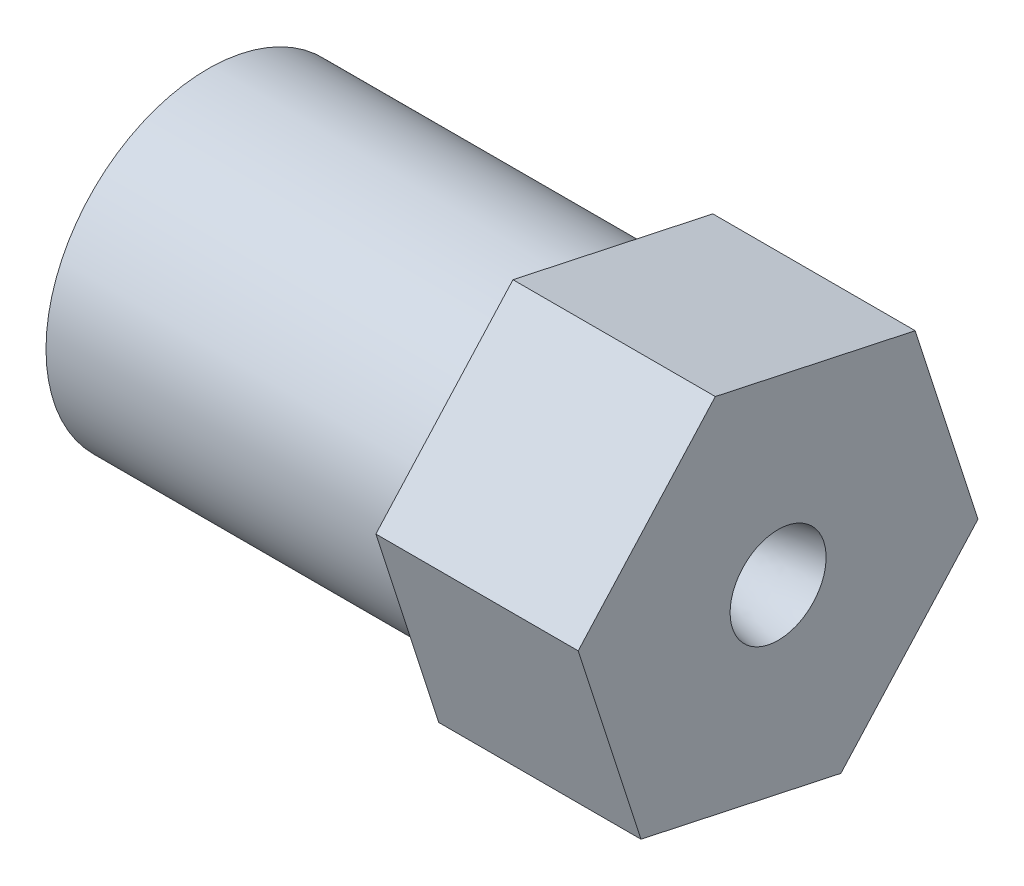
ISO-10303-21;
HEADER;
FILE_DESCRIPTION(('STEP AP214'),'2;1');
FILE_NAME('part.step','',(''),(''),'','','');
FILE_SCHEMA(('AUTOMOTIVE_DESIGN { 1 0 10303 214 1 1 1 1 }'));
ENDSEC;
DATA;
#1=APPLICATION_CONTEXT('core data for automotive mechanical design processes');
#2=APPLICATION_PROTOCOL_DEFINITION('international standard','automotive_design',2000,#1);
#3=PRODUCT_CONTEXT('',#1,'mechanical');
#4=PRODUCT('Part','Part','',(#3));
#5=PRODUCT_RELATED_PRODUCT_CATEGORY('part','',(#4));
#6=PRODUCT_DEFINITION_FORMATION('','',#4);
#7=PRODUCT_DEFINITION_CONTEXT('part definition',#1,'design');
#8=PRODUCT_DEFINITION('design','',#6,#7);
#9=PRODUCT_DEFINITION_SHAPE('','',#8);
#10=(LENGTH_UNIT() NAMED_UNIT(*) SI_UNIT(.MILLI.,.METRE.));
#11=(NAMED_UNIT(*) PLANE_ANGLE_UNIT() SI_UNIT($,.RADIAN.));
#12=(NAMED_UNIT(*) SI_UNIT($,.STERADIAN.) SOLID_ANGLE_UNIT());
#13=UNCERTAINTY_MEASURE_WITH_UNIT(LENGTH_MEASURE(1.E-05),#10,'distance_accuracy_value','');
#14=(GEOMETRIC_REPRESENTATION_CONTEXT(3) GLOBAL_UNCERTAINTY_ASSIGNED_CONTEXT((#13)) GLOBAL_UNIT_ASSIGNED_CONTEXT((#10,
#11,#12)) REPRESENTATION_CONTEXT('',''));
#15=CARTESIAN_POINT('',(0.,0.,0.));
#16=DIRECTION('',(0.,0.,1.));
#17=DIRECTION('',(1.,0.,0.));
#18=AXIS2_PLACEMENT_3D('',#15,#16,#17);
#19=CARTESIAN_POINT('',(0.,0.,0.));
#20=DIRECTION('',(-1.,0.,0.));
#21=DIRECTION('',(0.,0.,1.));
#22=AXIS2_PLACEMENT_3D('',#19,#20,#21);
#23=CYLINDRICAL_SURFACE('',#22,10.16);
#24=CARTESIAN_POINT('',(-9.29665282254042,0.,0.));
#25=DIRECTION('',(1.,0.,0.));
#26=DIRECTION('',(0.,0.,-1.));
#27=AXIS2_PLACEMENT_3D('',#24,#25,#26);
#28=CIRCLE('',#27,10.16);
#29=CARTESIAN_POINT('',(-9.29665282254042,0.,-10.16));
#30=VERTEX_POINT('',#29);
#31=EDGE_CURVE('E11',#30,#30,#28,.F.);
#32=ORIENTED_EDGE('',*,*,#31,.T.);
#33=EDGE_LOOP('',(#32));
#34=FACE_BOUND('',#33,.T.);
#35=CARTESIAN_POINT('',(-31.75,0.,0.));
#36=DIRECTION('',(-1.,0.,0.));
#37=DIRECTION('',(0.,0.,1.));
#38=AXIS2_PLACEMENT_3D('',#35,#36,#37);
#39=CIRCLE('',#38,10.16);
#40=CARTESIAN_POINT('',(-31.75,0.,10.16));
#41=VERTEX_POINT('',#40);
#42=EDGE_CURVE('E225',#41,#41,#39,.T.);
#43=ORIENTED_EDGE('',*,*,#42,.F.);
#44=EDGE_LOOP('',(#43));
#45=FACE_BOUND('',#44,.T.);
#46=ADVANCED_FACE('F37',(#34,#45),#23,.T.);
#47=CARTESIAN_POINT('',(0.,0.,0.));
#48=DIRECTION('',(-1.,0.,0.));
#49=DIRECTION('',(0.,0.,1.));
#50=AXIS2_PLACEMENT_3D('',#47,#48,#49);
#51=TOROIDAL_SURFACE('',#50,5.08,3.048);
#52=CARTESIAN_POINT('',(0.,0.,0.));
#53=DIRECTION('',(-1.,0.,0.));
#54=DIRECTION('',(0.,0.,1.));
#55=AXIS2_PLACEMENT_3D('',#52,#53,#54);
#56=CIRCLE('',#55,2.0319999999418);
#57=CARTESIAN_POINT('',(0.,0.,2.0319999999418));
#58=VERTEX_POINT('',#57);
#59=EDGE_CURVE('E177',#58,#58,#56,.T.);
#60=ORIENTED_EDGE('',*,*,#59,.F.);
#61=EDGE_LOOP('',(#60));
#62=FACE_BOUND('',#61,.T.);
#63=CARTESIAN_POINT('',(-2.15526146905657,0.,0.));
#64=DIRECTION('',(-1.,0.,0.));
#65=DIRECTION('',(0.,0.,1.));
#66=AXIS2_PLACEMENT_3D('',#63,#64,#65);
#67=CIRCLE('',#66,2.92473853094338);
#68=CARTESIAN_POINT('',(-2.15526146905657,0.,2.92473853094338));
#69=VERTEX_POINT('',#68);
#70=EDGE_CURVE('E142',#69,#69,#67,.T.);
#71=ORIENTED_EDGE('',*,*,#70,.T.);
#72=EDGE_LOOP('',(#71));
#73=FACE_BOUND('',#72,.T.);
#74=ADVANCED_FACE('F166',(#62,#73),#51,.T.);
#75=CARTESIAN_POINT('',(0.,0.,0.));
#76=DIRECTION('',(-1.,0.,0.));
#77=DIRECTION('',(0.,0.,1.));
#78=AXIS2_PLACEMENT_3D('',#75,#76,#77);
#79=TOROIDAL_SURFACE('',#78,2.8448,0.812800000058198);
#80=CARTESIAN_POINT('',(0.277993973659463,0.,0.));
#81=DIRECTION('',(-1.,0.,0.));
#82=DIRECTION('',(0.,0.,1.));
#83=AXIS2_PLACEMENT_3D('',#80,#81,#82);
#84=CIRCLE('',#83,2.08101783825132);
#85=CARTESIAN_POINT('',(0.277993973659463,0.,2.08101783825132));
#86=VERTEX_POINT('',#85);
#87=EDGE_CURVE('E231',#86,#86,#84,.T.);
#88=ORIENTED_EDGE('',*,*,#87,.F.);
#89=EDGE_LOOP('',(#88));
#90=FACE_BOUND('',#89,.T.);
#91=ORIENTED_EDGE('',*,*,#59,.T.);
#92=EDGE_LOOP('',(#91));
#93=FACE_BOUND('',#92,.T.);
#94=ADVANCED_FACE('F162',(#90,#93),#79,.T.);
#95=CARTESIAN_POINT('',(336362.672829223,-941749.791811561,0.));
#96=CARTESIAN_POINT('',(-342019.865333832,939694.701802969,0.));
#97=CARTESIAN_POINT('',(347678.16981433,-937631.287723025,0.));
#98=B_SPLINE_CURVE_WITH_KNOTS('',2,(#95,#96,#97),.UNSPECIFIED.,.F.,.F.,(3,3),(0.,1.),.UNSPECIFIED.);
#99=CARTESIAN_POINT('',(0.,0.,0.));
#100=DIRECTION('',(-1.,0.,0.));
#101=AXIS1_PLACEMENT('',#99,#100);
#102=SURFACE_OF_REVOLUTION('',#98,#101);
#103=CARTESIAN_POINT('',(4.03834717745957,0.,0.));
#104=DIRECTION('',(-1.,0.,0.));
#105=DIRECTION('',(0.,0.,1.));
#106=AXIS2_PLACEMENT_3D('',#103,#104,#105);
#107=CIRCLE('',#106,3.01394306515568);
#108=CARTESIAN_POINT('',(4.03834717745957,0.,3.01394306515568));
#109=VERTEX_POINT('',#108);
#110=EDGE_CURVE('E228',#109,#109,#107,.T.);
#111=ORIENTED_EDGE('',*,*,#110,.F.);
#112=EDGE_LOOP('',(#111));
#113=FACE_BOUND('',#112,.T.);
#114=ORIENTED_EDGE('',*,*,#87,.T.);
#115=EDGE_LOOP('',(#114));
#116=FACE_BOUND('',#115,.T.);
#117=ADVANCED_FACE('F157',(#113,#116),#102,.T.);
#118=CARTESIAN_POINT('',(4.03834717745957,10.16,0.));
#119=DIRECTION('',(-1.,0.,0.));
#120=DIRECTION('',(0.,0.,1.));
#121=AXIS2_PLACEMENT_3D('',#118,#119,#120);
#122=PLANE('',#121);
#123=ORIENTED_EDGE('',*,*,#110,.T.);
#124=EDGE_LOOP('',(#123));
#125=FACE_BOUND('',#124,.T.);
#126=DIRECTION('',(0.,-0.951681663898051,-0.307086324345838));
#127=VECTOR('',#126,1.);
#128=CARTESIAN_POINT('',(4.03834717745957,-3.41249677929312,10.5755624900671));
#129=LINE('',#128,#127);
#130=CARTESIAN_POINT('',(4.03834717745957,2.69330707117882,12.5457684242007));
#131=VERTEX_POINT('',#130);
#132=CARTESIAN_POINT('',(4.03834717745957,-9.51830062976507,8.60535655593348));
#133=VERTEX_POINT('',#132);
#134=EDGE_CURVE('E125',#131,#133,#129,.T.);
#135=ORIENTED_EDGE('',*,*,#134,.T.);
#136=DIRECTION('',(0.,-0.209896273910742,-0.977723659424475));
#137=VECTOR('',#136,1.);
#138=CARTESIAN_POINT('',(4.03834717745957,-10.8649541653545,2.33247234383312));
#139=LINE('',#138,#137);
#140=CARTESIAN_POINT('',(4.03834717745957,-12.2116077009439,-3.94041186826723));
#141=VERTEX_POINT('',#140);
#142=EDGE_CURVE('E128',#133,#141,#139,.T.);
#143=ORIENTED_EDGE('',*,*,#142,.T.);
#144=DIRECTION('',(0.,0.741785389987309,-0.670637335078637));
#145=VECTOR('',#144,1.);
#146=CARTESIAN_POINT('',(4.03834717745957,-7.45245738606136,-8.24309014623397));
#147=LINE('',#146,#145);
#148=CARTESIAN_POINT('',(4.03834717745957,-2.69330707117882,-12.5457684242007));
#149=VERTEX_POINT('',#148);
#150=EDGE_CURVE('E131',#141,#149,#147,.T.);
#151=ORIENTED_EDGE('',*,*,#150,.T.);
#152=DIRECTION('',(0.,0.951681663898051,0.307086324345838));
#153=VECTOR('',#152,1.);
#154=CARTESIAN_POINT('',(4.03834717745957,3.41249677929312,-10.5755624900671));
#155=LINE('',#154,#153);
#156=CARTESIAN_POINT('',(4.03834717745957,9.51830062976506,-8.60535655593348));
#157=VERTEX_POINT('',#156);
#158=EDGE_CURVE('E134',#149,#157,#155,.T.);
#159=ORIENTED_EDGE('',*,*,#158,.T.);
#160=DIRECTION('',(0.,0.209896273910742,0.977723659424475));
#161=VECTOR('',#160,1.);
#162=CARTESIAN_POINT('',(4.03834717745957,10.8649541653545,-2.33247234383312));
#163=LINE('',#162,#161);
#164=CARTESIAN_POINT('',(4.03834717745957,12.2116077009439,3.94041186826724));
#165=VERTEX_POINT('',#164);
#166=EDGE_CURVE('E102',#157,#165,#163,.T.);
#167=ORIENTED_EDGE('',*,*,#166,.T.);
#168=DIRECTION('',(0.,-0.741785389987309,0.670637335078637));
#169=VECTOR('',#168,1.);
#170=CARTESIAN_POINT('',(4.03834717745957,7.45245738606136,8.24309014623397));
#171=LINE('',#170,#169);
#172=EDGE_CURVE('E137',#165,#131,#171,.T.);
#173=ORIENTED_EDGE('',*,*,#172,.T.);
#174=EDGE_LOOP('',(#135,#143,#151,#159,#167,#173));
#175=FACE_BOUND('',#174,.T.);
#176=ADVANCED_FACE('F161',(#125,#175),#122,.F.);
#177=CARTESIAN_POINT('',(-31.75,10.16,0.));
#178=DIRECTION('',(1.,0.,0.));
#179=DIRECTION('',(0.,0.,-1.));
#180=AXIS2_PLACEMENT_3D('',#177,#178,#179);
#181=PLANE('',#180);
#182=CARTESIAN_POINT('',(-31.75,0.,0.));
#183=DIRECTION('',(-1.,0.,0.));
#184=DIRECTION('',(0.,0.,1.));
#185=AXIS2_PLACEMENT_3D('',#182,#183,#184);
#186=CIRCLE('',#185,8.6614);
#187=CARTESIAN_POINT('',(-31.75,0.,8.6614));
#188=VERTEX_POINT('',#187);
#189=EDGE_CURVE('E222',#188,#188,#186,.T.);
#190=ORIENTED_EDGE('',*,*,#189,.F.);
#191=EDGE_LOOP('',(#190));
#192=FACE_BOUND('',#191,.T.);
#193=ORIENTED_EDGE('',*,*,#42,.T.);
#194=EDGE_LOOP('',(#193));
#195=FACE_BOUND('',#194,.T.);
#196=ADVANCED_FACE('F249',(#192,#195),#181,.F.);
#197=CARTESIAN_POINT('',(-31.115,0.,0.));
#198=DIRECTION('',(-1.,0.,0.));
#199=DIRECTION('',(0.,0.,1.));
#200=AXIS2_PLACEMENT_3D('',#197,#198,#199);
#201=TOROIDAL_SURFACE('',#200,8.6614,0.635);
#202=CARTESIAN_POINT('',(-31.115,0.,0.));
#203=DIRECTION('',(-1.,0.,0.));
#204=DIRECTION('',(0.,0.,1.));
#205=AXIS2_PLACEMENT_3D('',#202,#203,#204);
#206=CIRCLE('',#205,8.02639999999999);
#207=CARTESIAN_POINT('',(-31.115,0.,8.02639999999999));
#208=VERTEX_POINT('',#207);
#209=EDGE_CURVE('E219',#208,#208,#206,.T.);
#210=ORIENTED_EDGE('',*,*,#209,.F.);
#211=EDGE_LOOP('',(#210));
#212=FACE_BOUND('',#211,.T.);
#213=ORIENTED_EDGE('',*,*,#189,.T.);
#214=EDGE_LOOP('',(#213));
#215=FACE_BOUND('',#214,.T.);
#216=ADVANCED_FACE('F251',(#212,#215),#201,.T.);
#217=CARTESIAN_POINT('',(0.,0.,0.));
#218=DIRECTION('',(-1.,0.,0.));
#219=DIRECTION('',(0.,0.,1.));
#220=AXIS2_PLACEMENT_3D('',#217,#218,#219);
#221=CYLINDRICAL_SURFACE('',#220,8.02639999999999);
#222=CARTESIAN_POINT('',(-25.019,0.,0.));
#223=DIRECTION('',(-1.,0.,0.));
#224=DIRECTION('',(0.,0.,1.));
#225=AXIS2_PLACEMENT_3D('',#222,#223,#224);
#226=CIRCLE('',#225,8.02639999999999);
#227=CARTESIAN_POINT('',(-25.019,0.,8.02639999999999));
#228=VERTEX_POINT('',#227);
#229=EDGE_CURVE('E216',#228,#228,#226,.T.);
#230=ORIENTED_EDGE('',*,*,#229,.F.);
#231=EDGE_LOOP('',(#230));
#232=FACE_BOUND('',#231,.T.);
#233=ORIENTED_EDGE('',*,*,#209,.T.);
#234=EDGE_LOOP('',(#233));
#235=FACE_BOUND('',#234,.T.);
#236=ADVANCED_FACE('F258',(#232,#235),#221,.F.);
#237=CARTESIAN_POINT('',(-25.019,0.,0.));
#238=DIRECTION('',(-1.,0.,0.));
#239=DIRECTION('',(0.,0.,1.));
#240=AXIS2_PLACEMENT_3D('',#237,#238,#239);
#241=TOROIDAL_SURFACE('',#240,7.89939999999999,0.127);
#242=CARTESIAN_POINT('',(-24.892,0.,0.));
#243=DIRECTION('',(-1.,0.,0.));
#244=DIRECTION('',(0.,0.,1.));
#245=AXIS2_PLACEMENT_3D('',#242,#243,#244);
#246=CIRCLE('',#245,7.89939999999999);
#247=CARTESIAN_POINT('',(-24.892,0.,7.89939999999999));
#248=VERTEX_POINT('',#247);
#249=EDGE_CURVE('E213',#248,#248,#246,.T.);
#250=ORIENTED_EDGE('',*,*,#249,.F.);
#251=EDGE_LOOP('',(#250));
#252=FACE_BOUND('',#251,.T.);
#253=ORIENTED_EDGE('',*,*,#229,.T.);
#254=EDGE_LOOP('',(#253));
#255=FACE_BOUND('',#254,.T.);
#256=ADVANCED_FACE('F266',(#252,#255),#241,.F.);
#257=CARTESIAN_POINT('',(-24.892,6.9469,0.));
#258=DIRECTION('',(1.,0.,0.));
#259=DIRECTION('',(0.,0.,-1.));
#260=AXIS2_PLACEMENT_3D('',#257,#258,#259);
#261=PLANE('',#260);
#262=CARTESIAN_POINT('',(-24.892,0.,0.));
#263=DIRECTION('',(-1.,0.,0.));
#264=DIRECTION('',(0.,0.,1.));
#265=AXIS2_PLACEMENT_3D('',#262,#263,#264);
#266=CIRCLE('',#265,6.9469);
#267=CARTESIAN_POINT('',(-24.892,0.,6.9469));
#268=VERTEX_POINT('',#267);
#269=EDGE_CURVE('E210',#268,#268,#266,.T.);
#270=ORIENTED_EDGE('',*,*,#269,.F.);
#271=EDGE_LOOP('',(#270));
#272=FACE_BOUND('',#271,.T.);
#273=ORIENTED_EDGE('',*,*,#249,.T.);
#274=EDGE_LOOP('',(#273));
#275=FACE_BOUND('',#274,.T.);
#276=ADVANCED_FACE('F270',(#272,#275),#261,.F.);
#277=CARTESIAN_POINT('',(0.,0.,0.));
#278=DIRECTION('',(-1.,0.,0.));
#279=DIRECTION('',(0.,0.,1.));
#280=AXIS2_PLACEMENT_3D('',#277,#278,#279);
#281=CYLINDRICAL_SURFACE('',#280,6.9469);
#282=CARTESIAN_POINT('',(-20.066,0.,0.));
#283=DIRECTION('',(-1.,0.,0.));
#284=DIRECTION('',(0.,0.,1.));
#285=AXIS2_PLACEMENT_3D('',#282,#283,#284);
#286=CIRCLE('',#285,6.9469);
#287=CARTESIAN_POINT('',(-20.066,0.,6.9469));
#288=VERTEX_POINT('',#287);
#289=EDGE_CURVE('E207',#288,#288,#286,.T.);
#290=ORIENTED_EDGE('',*,*,#289,.F.);
#291=EDGE_LOOP('',(#290));
#292=FACE_BOUND('',#291,.T.);
#293=ORIENTED_EDGE('',*,*,#269,.T.);
#294=EDGE_LOOP('',(#293));
#295=FACE_BOUND('',#294,.T.);
#296=ADVANCED_FACE('F274',(#292,#295),#281,.F.);
#297=CARTESIAN_POINT('',(-20.066,0.,0.));
#298=DIRECTION('',(-1.,0.,0.));
#299=DIRECTION('',(0.,0.,1.));
#300=AXIS2_PLACEMENT_3D('',#297,#298,#299);
#301=TOROIDAL_SURFACE('',#300,6.8199,0.127);
#302=CARTESIAN_POINT('',(-19.939,0.,0.));
#303=DIRECTION('',(-1.,0.,0.));
#304=DIRECTION('',(0.,0.,1.));
#305=AXIS2_PLACEMENT_3D('',#302,#303,#304);
#306=CIRCLE('',#305,6.8199);
#307=CARTESIAN_POINT('',(-19.939,0.,6.8199));
#308=VERTEX_POINT('',#307);
#309=EDGE_CURVE('E204',#308,#308,#306,.T.);
#310=ORIENTED_EDGE('',*,*,#309,.F.);
#311=EDGE_LOOP('',(#310));
#312=FACE_BOUND('',#311,.T.);
#313=ORIENTED_EDGE('',*,*,#289,.T.);
#314=EDGE_LOOP('',(#313));
#315=FACE_BOUND('',#314,.T.);
#316=ADVANCED_FACE('F278',(#312,#315),#301,.F.);
#317=CARTESIAN_POINT('',(-19.939,5.46100000000001,0.));
#318=DIRECTION('',(1.,0.,0.));
#319=DIRECTION('',(0.,0.,-1.));
#320=AXIS2_PLACEMENT_3D('',#317,#318,#319);
#321=PLANE('',#320);
#322=CARTESIAN_POINT('',(-19.939,0.,0.));
#323=DIRECTION('',(-1.,0.,0.));
#324=DIRECTION('',(0.,0.,1.));
#325=AXIS2_PLACEMENT_3D('',#322,#323,#324);
#326=CIRCLE('',#325,5.46100000000001);
#327=CARTESIAN_POINT('',(-19.939,0.,5.46100000000001));
#328=VERTEX_POINT('',#327);
#329=EDGE_CURVE('E201',#328,#328,#326,.T.);
#330=ORIENTED_EDGE('',*,*,#329,.F.);
#331=EDGE_LOOP('',(#330));
#332=FACE_BOUND('',#331,.T.);
#333=ORIENTED_EDGE('',*,*,#309,.T.);
#334=EDGE_LOOP('',(#333));
#335=FACE_BOUND('',#334,.T.);
#336=ADVANCED_FACE('F282',(#332,#335),#321,.F.);
#337=CARTESIAN_POINT('',(-19.304,0.,0.));
#338=DIRECTION('',(-1.,0.,0.));
#339=DIRECTION('',(0.,0.,1.));
#340=AXIS2_PLACEMENT_3D('',#337,#338,#339);
#341=TOROIDAL_SURFACE('',#340,5.461,0.635);
#342=CARTESIAN_POINT('',(-19.304,0.,0.));
#343=DIRECTION('',(-1.,0.,0.));
#344=DIRECTION('',(0.,0.,1.));
#345=AXIS2_PLACEMENT_3D('',#342,#343,#344);
#346=CIRCLE('',#345,4.826);
#347=CARTESIAN_POINT('',(-19.304,0.,4.826));
#348=VERTEX_POINT('',#347);
#349=EDGE_CURVE('E198',#348,#348,#346,.T.);
#350=ORIENTED_EDGE('',*,*,#349,.F.);
#351=EDGE_LOOP('',(#350));
#352=FACE_BOUND('',#351,.T.);
#353=ORIENTED_EDGE('',*,*,#329,.T.);
#354=EDGE_LOOP('',(#353));
#355=FACE_BOUND('',#354,.T.);
#356=ADVANCED_FACE('F286',(#352,#355),#341,.T.);
#357=CARTESIAN_POINT('',(0.,0.,0.));
#358=DIRECTION('',(-1.,0.,0.));
#359=DIRECTION('',(0.,0.,1.));
#360=AXIS2_PLACEMENT_3D('',#357,#358,#359);
#361=CYLINDRICAL_SURFACE('',#360,4.826);
#362=CARTESIAN_POINT('',(-13.589,0.,0.));
#363=DIRECTION('',(-1.,0.,0.));
#364=DIRECTION('',(0.,0.,1.));
#365=AXIS2_PLACEMENT_3D('',#362,#363,#364);
#366=CIRCLE('',#365,4.826);
#367=CARTESIAN_POINT('',(-13.589,0.,4.826));
#368=VERTEX_POINT('',#367);
#369=EDGE_CURVE('E195',#368,#368,#366,.T.);
#370=ORIENTED_EDGE('',*,*,#369,.F.);
#371=EDGE_LOOP('',(#370));
#372=FACE_BOUND('',#371,.T.);
#373=ORIENTED_EDGE('',*,*,#349,.T.);
#374=EDGE_LOOP('',(#373));
#375=FACE_BOUND('',#374,.T.);
#376=ADVANCED_FACE('F290',(#372,#375),#361,.F.);
#377=CARTESIAN_POINT('',(-13.589,0.,0.));
#378=DIRECTION('',(-1.,0.,0.));
#379=DIRECTION('',(0.,0.,1.));
#380=AXIS2_PLACEMENT_3D('',#377,#378,#379);
#381=TOROIDAL_SURFACE('',#380,4.699,0.127);
#382=CARTESIAN_POINT('',(-13.462,0.,0.));
#383=DIRECTION('',(-1.,0.,0.));
#384=DIRECTION('',(0.,0.,1.));
#385=AXIS2_PLACEMENT_3D('',#382,#383,#384);
#386=CIRCLE('',#385,4.699);
#387=CARTESIAN_POINT('',(-13.462,0.,4.699));
#388=VERTEX_POINT('',#387);
#389=EDGE_CURVE('E192',#388,#388,#386,.T.);
#390=ORIENTED_EDGE('',*,*,#389,.F.);
#391=EDGE_LOOP('',(#390));
#392=FACE_BOUND('',#391,.T.);
#393=ORIENTED_EDGE('',*,*,#369,.T.);
#394=EDGE_LOOP('',(#393));
#395=FACE_BOUND('',#394,.T.);
#396=ADVANCED_FACE('F294',(#392,#395),#381,.F.);
#397=CARTESIAN_POINT('',(-13.462,4.445,0.));
#398=DIRECTION('',(1.,0.,0.));
#399=DIRECTION('',(0.,0.,-1.));
#400=AXIS2_PLACEMENT_3D('',#397,#398,#399);
#401=PLANE('',#400);
#402=CARTESIAN_POINT('',(-13.462,0.,0.));
#403=DIRECTION('',(-1.,0.,0.));
#404=DIRECTION('',(0.,0.,1.));
#405=AXIS2_PLACEMENT_3D('',#402,#403,#404);
#406=CIRCLE('',#405,4.445);
#407=CARTESIAN_POINT('',(-13.462,0.,4.445));
#408=VERTEX_POINT('',#407);
#409=EDGE_CURVE('E187',#408,#408,#406,.T.);
#410=ORIENTED_EDGE('',*,*,#409,.F.);
#411=EDGE_LOOP('',(#410));
#412=FACE_BOUND('',#411,.T.);
#413=ORIENTED_EDGE('',*,*,#389,.T.);
#414=EDGE_LOOP('',(#413));
#415=FACE_BOUND('',#414,.T.);
#416=ADVANCED_FACE('F298',(#412,#415),#401,.F.);
#417=CARTESIAN_POINT('',(0.,0.,0.));
#418=DIRECTION('',(-1.,0.,0.));
#419=DIRECTION('',(0.,0.,1.));
#420=AXIS2_PLACEMENT_3D('',#417,#418,#419);
#421=CYLINDRICAL_SURFACE('',#420,4.445);
#422=CARTESIAN_POINT('',(-4.99065099864778,0.,0.));
#423=DIRECTION('',(-1.,0.,0.));
#424=DIRECTION('',(0.,0.,1.));
#425=AXIS2_PLACEMENT_3D('',#422,#423,#424);
#426=CIRCLE('',#425,4.445);
#427=CARTESIAN_POINT('',(-4.99065099864778,0.,4.445));
#428=VERTEX_POINT('',#427);
#429=EDGE_CURVE('E183',#428,#428,#426,.T.);
#430=ORIENTED_EDGE('',*,*,#429,.F.);
#431=EDGE_LOOP('',(#430));
#432=FACE_BOUND('',#431,.T.);
#433=ORIENTED_EDGE('',*,*,#409,.T.);
#434=EDGE_LOOP('',(#433));
#435=FACE_BOUND('',#434,.T.);
#436=ADVANCED_FACE('F302',(#432,#435),#421,.F.);
#437=CARTESIAN_POINT('',(-4.99065099864778,0.,0.));
#438=DIRECTION('',(-1.,0.,0.));
#439=DIRECTION('',(0.,0.,1.));
#440=AXIS2_PLACEMENT_3D('',#437,#438,#439);
#441=DEGENERATE_TOROIDAL_SURFACE('',#440,1.27,3.175,.T.);
#442=CARTESIAN_POINT('',(-2.74558696838052,0.,0.));
#443=DIRECTION('',(-1.,0.,0.));
#444=DIRECTION('',(0.,0.,1.));
#445=AXIS2_PLACEMENT_3D('',#442,#443,#444);
#446=CIRCLE('',#445,3.51506403026731);
#447=CARTESIAN_POINT('',(-2.74558696838052,0.,3.51506403026731));
#448=VERTEX_POINT('',#447);
#449=EDGE_CURVE('E181',#448,#448,#446,.T.);
#450=ORIENTED_EDGE('',*,*,#449,.F.);
#451=EDGE_LOOP('',(#450));
#452=FACE_BOUND('',#451,.T.);
#453=ORIENTED_EDGE('',*,*,#429,.T.);
#454=EDGE_LOOP('',(#453));
#455=FACE_BOUND('',#454,.T.);
#456=ADVANCED_FACE('F306',(#452,#455),#441,.F.);
#457=CARTESIAN_POINT('',(-2.74558696838052,0.,0.));
#458=DIRECTION('',(-1.,0.,0.));
#459=DIRECTION('',(0.,0.,1.));
#460=AXIS2_PLACEMENT_3D('',#457,#458,#459);
#461=CONICAL_SURFACE('',#460,3.51506403026731,0.785398163397437);
#462=ORIENTED_EDGE('',*,*,#70,.F.);
#463=EDGE_LOOP('',(#462));
#464=FACE_BOUND('',#463,.T.);
#465=ORIENTED_EDGE('',*,*,#449,.T.);
#466=EDGE_LOOP('',(#465));
#467=FACE_BOUND('',#466,.T.);
#468=ADVANCED_FACE('F310',(#464,#467),#461,.F.);
#469=CARTESIAN_POINT('',(-8.66165282254042,-3.41249677929312,10.5755624900671));
#470=DIRECTION('',(0.,-0.307086324345838,0.951681663898051));
#471=DIRECTION('',(0.,-0.951681663898051,-0.307086324345838));
#472=AXIS2_PLACEMENT_3D('',#469,#470,#471);
#473=PLANE('',#472);
#474=ORIENTED_EDGE('',*,*,#134,.F.);
#475=DIRECTION('',(1.,0.,0.));
#476=VECTOR('',#475,1.);
#477=CARTESIAN_POINT('',(-8.66165282254042,2.69330707117882,12.5457684242007));
#478=LINE('',#477,#476);
#479=CARTESIAN_POINT('',(-8.66165282254042,2.69330707117882,12.5457684242007));
#480=VERTEX_POINT('',#479);
#481=EDGE_CURVE('E54',#480,#131,#478,.T.);
#482=ORIENTED_EDGE('',*,*,#481,.F.);
#483=DIRECTION('',(0.,-0.951681663898051,-0.307086324345838));
#484=VECTOR('',#483,1.);
#485=CARTESIAN_POINT('',(-8.66165282254042,-3.41249677929312,10.5755624900671));
#486=LINE('',#485,#484);
#487=CARTESIAN_POINT('',(-8.66165282254042,-9.51830062976507,8.60535655593348));
#488=VERTEX_POINT('',#487);
#489=EDGE_CURVE('E140',#480,#488,#486,.T.);
#490=ORIENTED_EDGE('',*,*,#489,.T.);
#491=DIRECTION('',(1.,0.,0.));
#492=VECTOR('',#491,1.);
#493=CARTESIAN_POINT('',(-8.66165282254042,-9.51830062976507,8.60535655593348));
#494=LINE('',#493,#492);
#495=EDGE_CURVE('E89',#488,#133,#494,.T.);
#496=ORIENTED_EDGE('',*,*,#495,.T.);
#497=EDGE_LOOP('',(#474,#482,#490,#496));
#498=FACE_BOUND('',#497,.T.);
#499=ADVANCED_FACE('F314',(#498),#473,.T.);
#500=CARTESIAN_POINT('',(-8.66165282254042,7.45245738606136,8.24309014623397));
#501=DIRECTION('',(0.,0.670637335078637,0.741785389987309));
#502=DIRECTION('',(0.,-0.741785389987309,0.670637335078637));
#503=AXIS2_PLACEMENT_3D('',#500,#501,#502);
#504=PLANE('',#503);
#505=ORIENTED_EDGE('',*,*,#172,.F.);
#506=DIRECTION('',(1.,0.,0.));
#507=VECTOR('',#506,1.);
#508=CARTESIAN_POINT('',(-8.66165282254042,12.2116077009439,3.94041186826724));
#509=LINE('',#508,#507);
#510=CARTESIAN_POINT('',(-8.66165282254042,12.2116077009439,3.94041186826724));
#511=VERTEX_POINT('',#510);
#512=EDGE_CURVE('E77',#511,#165,#509,.T.);
#513=ORIENTED_EDGE('',*,*,#512,.F.);
#514=DIRECTION('',(0.,-0.741785389987309,0.670637335078637));
#515=VECTOR('',#514,1.);
#516=CARTESIAN_POINT('',(-8.66165282254042,7.45245738606136,8.24309014623397));
#517=LINE('',#516,#515);
#518=EDGE_CURVE('E115',#511,#480,#517,.T.);
#519=ORIENTED_EDGE('',*,*,#518,.T.);
#520=ORIENTED_EDGE('',*,*,#481,.T.);
#521=EDGE_LOOP('',(#505,#513,#519,#520));
#522=FACE_BOUND('',#521,.T.);
#523=ADVANCED_FACE('F317',(#522),#504,.T.);
#524=CARTESIAN_POINT('',(-8.66165282254042,10.8649541653545,-2.33247234383312));
#525=DIRECTION('',(0.,0.977723659424475,-0.209896273910742));
#526=DIRECTION('',(0.,0.209896273910742,0.977723659424475));
#527=AXIS2_PLACEMENT_3D('',#524,#525,#526);
#528=PLANE('',#527);
#529=ORIENTED_EDGE('',*,*,#166,.F.);
#530=DIRECTION('',(1.,0.,0.));
#531=VECTOR('',#530,1.);
#532=CARTESIAN_POINT('',(-8.66165282254042,9.51830062976506,-8.60535655593348));
#533=LINE('',#532,#531);
#534=CARTESIAN_POINT('',(-8.66165282254042,9.51830062976506,-8.60535655593348));
#535=VERTEX_POINT('',#534);
#536=EDGE_CURVE('E97',#535,#157,#533,.T.);
#537=ORIENTED_EDGE('',*,*,#536,.F.);
#538=DIRECTION('',(0.,0.209896273910742,0.977723659424475));
#539=VECTOR('',#538,1.);
#540=CARTESIAN_POINT('',(-8.66165282254042,10.8649541653545,-2.33247234383312));
#541=LINE('',#540,#539);
#542=EDGE_CURVE('E100',#535,#511,#541,.T.);
#543=ORIENTED_EDGE('',*,*,#542,.T.);
#544=ORIENTED_EDGE('',*,*,#512,.T.);
#545=EDGE_LOOP('',(#529,#537,#543,#544));
#546=FACE_BOUND('',#545,.T.);
#547=ADVANCED_FACE('F99',(#546),#528,.T.);
#548=CARTESIAN_POINT('',(-8.66165282254042,3.41249677929312,-10.5755624900671));
#549=DIRECTION('',(0.,0.307086324345838,-0.951681663898051));
#550=DIRECTION('',(0.,0.951681663898051,0.307086324345838));
#551=AXIS2_PLACEMENT_3D('',#548,#549,#550);
#552=PLANE('',#551);
#553=ORIENTED_EDGE('',*,*,#158,.F.);
#554=DIRECTION('',(1.,0.,0.));
#555=VECTOR('',#554,1.);
#556=CARTESIAN_POINT('',(-8.66165282254042,-2.69330707117882,-12.5457684242007));
#557=LINE('',#556,#555);
#558=CARTESIAN_POINT('',(-8.66165282254042,-2.69330707117882,-12.5457684242007));
#559=VERTEX_POINT('',#558);
#560=EDGE_CURVE('E107',#559,#149,#557,.T.);
#561=ORIENTED_EDGE('',*,*,#560,.F.);
#562=DIRECTION('',(0.,0.951681663898051,0.307086324345838));
#563=VECTOR('',#562,1.);
#564=CARTESIAN_POINT('',(-8.66165282254042,3.41249677929312,-10.5755624900671));
#565=LINE('',#564,#563);
#566=EDGE_CURVE('E113',#559,#535,#565,.T.);
#567=ORIENTED_EDGE('',*,*,#566,.T.);
#568=ORIENTED_EDGE('',*,*,#536,.T.);
#569=EDGE_LOOP('',(#553,#561,#567,#568));
#570=FACE_BOUND('',#569,.T.);
#571=ADVANCED_FACE('F117',(#570),#552,.T.);
#572=CARTESIAN_POINT('',(-8.66165282254042,-7.45245738606136,-8.24309014623397));
#573=DIRECTION('',(0.,-0.670637335078637,-0.741785389987309));
#574=DIRECTION('',(0.,0.741785389987309,-0.670637335078637));
#575=AXIS2_PLACEMENT_3D('',#572,#573,#574);
#576=PLANE('',#575);
#577=ORIENTED_EDGE('',*,*,#150,.F.);
#578=DIRECTION('',(1.,0.,0.));
#579=VECTOR('',#578,1.);
#580=CARTESIAN_POINT('',(-8.66165282254042,-12.2116077009439,-3.94041186826723));
#581=LINE('',#580,#579);
#582=CARTESIAN_POINT('',(-8.66165282254042,-12.2116077009439,-3.94041186826723));
#583=VERTEX_POINT('',#582);
#584=EDGE_CURVE('E145',#583,#141,#581,.T.);
#585=ORIENTED_EDGE('',*,*,#584,.F.);
#586=DIRECTION('',(0.,0.741785389987309,-0.670637335078637));
#587=VECTOR('',#586,1.);
#588=CARTESIAN_POINT('',(-8.66165282254042,-7.45245738606136,-8.24309014623397));
#589=LINE('',#588,#587);
#590=EDGE_CURVE('E118',#583,#559,#589,.T.);
#591=ORIENTED_EDGE('',*,*,#590,.T.);
#592=ORIENTED_EDGE('',*,*,#560,.T.);
#593=EDGE_LOOP('',(#577,#585,#591,#592));
#594=FACE_BOUND('',#593,.T.);
#595=ADVANCED_FACE('F320',(#594),#576,.T.);
#596=CARTESIAN_POINT('',(-8.66165282254042,-10.8649541653545,2.33247234383312));
#597=DIRECTION('',(0.,-0.977723659424475,0.209896273910742));
#598=DIRECTION('',(0.,-0.209896273910742,-0.977723659424475));
#599=AXIS2_PLACEMENT_3D('',#596,#597,#598);
#600=PLANE('',#599);
#601=ORIENTED_EDGE('',*,*,#142,.F.);
#602=ORIENTED_EDGE('',*,*,#495,.F.);
#603=DIRECTION('',(0.,-0.209896273910742,-0.977723659424475));
#604=VECTOR('',#603,1.);
#605=CARTESIAN_POINT('',(-8.66165282254042,-10.8649541653545,2.33247234383312));
#606=LINE('',#605,#604);
#607=EDGE_CURVE('E120',#488,#583,#606,.T.);
#608=ORIENTED_EDGE('',*,*,#607,.T.);
#609=ORIENTED_EDGE('',*,*,#584,.T.);
#610=EDGE_LOOP('',(#601,#602,#608,#609));
#611=FACE_BOUND('',#610,.T.);
#612=ADVANCED_FACE('F243',(#611),#600,.T.);
#613=CARTESIAN_POINT('',(-8.66165282254042,0.,0.));
#614=DIRECTION('',(1.,0.,0.));
#615=DIRECTION('',(0.,0.,-1.));
#616=AXIS2_PLACEMENT_3D('',#613,#614,#615);
#617=PLANE('',#616);
#618=CARTESIAN_POINT('',(-8.66165282254042,0.,0.));
#619=DIRECTION('',(1.,0.,0.));
#620=DIRECTION('',(0.,0.,-1.));
#621=AXIS2_PLACEMENT_3D('',#618,#619,#620);
#622=CIRCLE('',#621,10.795);
#623=CARTESIAN_POINT('',(-8.66165282254042,0.,-10.795));
#624=VERTEX_POINT('',#623);
#625=EDGE_CURVE('E46',#624,#624,#622,.T.);
#626=ORIENTED_EDGE('',*,*,#625,.T.);
#627=EDGE_LOOP('',(#626));
#628=FACE_BOUND('',#627,.T.);
#629=ORIENTED_EDGE('',*,*,#489,.F.);
#630=ORIENTED_EDGE('',*,*,#518,.F.);
#631=ORIENTED_EDGE('',*,*,#542,.F.);
#632=ORIENTED_EDGE('',*,*,#566,.F.);
#633=ORIENTED_EDGE('',*,*,#590,.F.);
#634=ORIENTED_EDGE('',*,*,#607,.F.);
#635=EDGE_LOOP('',(#629,#630,#631,#632,#633,#634));
#636=FACE_BOUND('',#635,.T.);
#637=ADVANCED_FACE('F111',(#628,#636),#617,.F.);
#638=CARTESIAN_POINT('',(-9.29665282254042,0.,0.));
#639=DIRECTION('',(1.,0.,0.));
#640=DIRECTION('',(0.,0.,-1.));
#641=AXIS2_PLACEMENT_3D('',#638,#639,#640);
#642=TOROIDAL_SURFACE('',#641,10.795,0.635);
#643=ORIENTED_EDGE('',*,*,#31,.F.);
#644=EDGE_LOOP('',(#643));
#645=FACE_BOUND('',#644,.T.);
#646=ORIENTED_EDGE('',*,*,#625,.F.);
#647=EDGE_LOOP('',(#646));
#648=FACE_BOUND('',#647,.T.);
#649=ADVANCED_FACE('F39',(#645,#648),#642,.F.);
#650=CLOSED_SHELL('',(#46,#74,#94,#117,#176,#196,#216,#236,#256,#276,#296,#316,#336,#356,#376,
#396,#416,#436,#456,#468,#499,#523,#547,#571,#595,#612,#637,#649));
#651=MANIFOLD_SOLID_BREP('B2',#650);
#652=ADVANCED_BREP_SHAPE_REPRESENTATION('',(#18,#651),#14);
#653=SHAPE_DEFINITION_REPRESENTATION(#9,#652);
ENDSEC;
END-ISO-10303-21;
